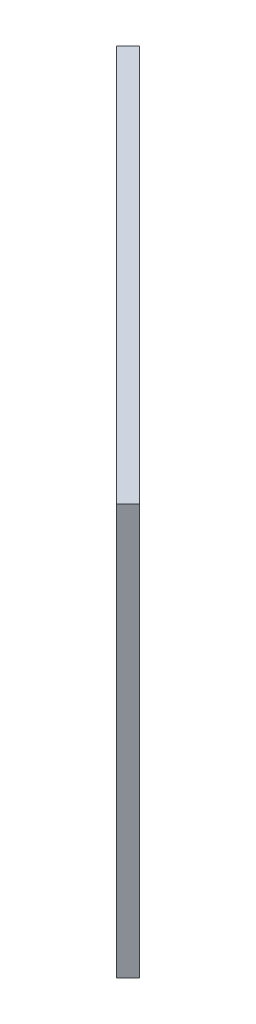
ISO-10303-21;
HEADER;
FILE_DESCRIPTION(('STEP AP214'),'2;1');
FILE_NAME('part.step','',(''),(''),'','','');
FILE_SCHEMA(('AUTOMOTIVE_DESIGN { 1 0 10303 214 1 1 1 1 }'));
ENDSEC;
DATA;
#1=APPLICATION_CONTEXT('core data for automotive mechanical design processes');
#2=APPLICATION_PROTOCOL_DEFINITION('international standard','automotive_design',2000,#1);
#3=PRODUCT_CONTEXT('',#1,'mechanical');
#4=PRODUCT('Part','Part','',(#3));
#5=PRODUCT_RELATED_PRODUCT_CATEGORY('part','',(#4));
#6=PRODUCT_DEFINITION_FORMATION('','',#4);
#7=PRODUCT_DEFINITION_CONTEXT('part definition',#1,'design');
#8=PRODUCT_DEFINITION('design','',#6,#7);
#9=PRODUCT_DEFINITION_SHAPE('','',#8);
#10=(LENGTH_UNIT() NAMED_UNIT(*) SI_UNIT(.MILLI.,.METRE.));
#11=(NAMED_UNIT(*) PLANE_ANGLE_UNIT() SI_UNIT($,.RADIAN.));
#12=(NAMED_UNIT(*) SI_UNIT($,.STERADIAN.) SOLID_ANGLE_UNIT());
#13=UNCERTAINTY_MEASURE_WITH_UNIT(LENGTH_MEASURE(1.E-05),#10,'distance_accuracy_value','');
#14=(GEOMETRIC_REPRESENTATION_CONTEXT(3) GLOBAL_UNCERTAINTY_ASSIGNED_CONTEXT((#13)) GLOBAL_UNIT_ASSIGNED_CONTEXT((#10,
#11,#12)) REPRESENTATION_CONTEXT('',''));
#15=CARTESIAN_POINT('',(0.,0.,0.));
#16=DIRECTION('',(0.,0.,1.));
#17=DIRECTION('',(1.,0.,0.));
#18=AXIS2_PLACEMENT_3D('',#15,#16,#17);
#19=CARTESIAN_POINT('',(-170.601466374617,0.,1800.11581859632));
#20=DIRECTION('',(-0.707106781186548,0.,0.707106781186547));
#21=DIRECTION('',(0.707106781186547,0.,0.707106781186548));
#22=AXIS2_PLACEMENT_3D('',#19,#20,#21);
#23=PLANE('',#22);
#24=CARTESIAN_POINT('',(-175.470561243431,0.,1795.24672372763));
#25=DIRECTION('',(0.707106781186548,0.,-0.707106781186548));
#26=DIRECTION('',(-0.707106781186548,0.,-0.707106781186548));
#27=AXIS2_PLACEMENT_3D('',#24,#25,#26);
#28=CIRCLE('',#27,9.525);
#29=CARTESIAN_POINT('',(-182.205753334233,0.,1788.51153163683));
#30=VERTEX_POINT('',#29);
#31=EDGE_CURVE('E19',#30,#30,#28,.T.);
#32=ORIENTED_EDGE('',*,*,#31,.T.);
#33=EDGE_LOOP('',(#32));
#34=FACE_BOUND('',#33,.T.);
#35=DIRECTION('',(0.,1.,0.));
#36=VECTOR('',#35,1.);
#37=CARTESIAN_POINT('',(-155.264984971073,-1.75839247554533,1815.45229999996));
#38=LINE('',#37,#36);
#39=CARTESIAN_POINT('',(-155.264984971025,15.875,1815.45229999996));
#40=VERTEX_POINT('',#39);
#41=CARTESIAN_POINT('',(-155.264984971031,-15.875,1815.45229999996));
#42=VERTEX_POINT('',#41);
#43=EDGE_CURVE('E57',#40,#42,#38,.F.);
#44=ORIENTED_EDGE('',*,*,#43,.F.);
#45=DIRECTION('',(0.707106781186837,0.,0.707106781186258));
#46=VECTOR('',#45,1.);
#47=CARTESIAN_POINT('',(-185.937947778174,15.875,1784.77933719289));
#48=LINE('',#47,#46);
#49=CARTESIAN_POINT('',(-185.937947778149,15.875,1784.77933719285));
#50=VERTEX_POINT('',#49);
#51=EDGE_CURVE('E52',#50,#40,#48,.T.);
#52=ORIENTED_EDGE('',*,*,#51,.F.);
#53=DIRECTION('',(0.,1.,0.));
#54=VECTOR('',#53,1.);
#55=CARTESIAN_POINT('',(-185.937947778199,0.751782462000776,1784.77933719286));
#56=LINE('',#55,#54);
#57=CARTESIAN_POINT('',(-185.937947778149,-15.875,1784.77933719285));
#58=VERTEX_POINT('',#57);
#59=EDGE_CURVE('E69',#58,#50,#56,.T.);
#60=ORIENTED_EDGE('',*,*,#59,.F.);
#61=DIRECTION('',(-0.707106781186544,0.,-0.707106781186551));
#62=VECTOR('',#61,1.);
#63=CARTESIAN_POINT('',(-155.26498497106,-15.875,1815.4523));
#64=LINE('',#63,#62);
#65=EDGE_CURVE('E66',#42,#58,#64,.T.);
#66=ORIENTED_EDGE('',*,*,#65,.F.);
#67=EDGE_LOOP('',(#44,#52,#60,#66));
#68=FACE_BOUND('',#67,.T.);
#69=ADVANCED_FACE('F16',(#34,#68),#23,.T.);
#70=CARTESIAN_POINT('',(-160.929626454124,-15.875,1807.9732875702));
#71=DIRECTION('',(0.,-1.,0.));
#72=DIRECTION('',(0.,0.,-1.));
#73=AXIS2_PLACEMENT_3D('',#70,#71,#72);
#74=PLANE('',#73);
#75=DIRECTION('',(0.707106781186547,0.,0.707106781186548));
#76=VECTOR('',#75,1.);
#77=CARTESIAN_POINT('',(-169.69428090126,-15.875,1799.20863312316));
#78=LINE('',#77,#76);
#79=CARTESIAN_POINT('',(-185.030762304839,-15.875,1783.87215171949));
#80=VERTEX_POINT('',#79);
#81=CARTESIAN_POINT('',(-154.357799497738,-15.875,1814.54511452661));
#82=VERTEX_POINT('',#81);
#83=EDGE_CURVE('E76',#80,#82,#78,.T.);
#84=ORIENTED_EDGE('',*,*,#83,.T.);
#85=DIRECTION('',(0.707106781186547,0.,-0.707106781186548));
#86=VECTOR('',#85,1.);
#87=CARTESIAN_POINT('',(-154.357799497703,-15.875,1814.54511452659));
#88=LINE('',#87,#86);
#89=EDGE_CURVE('E62',#42,#82,#88,.T.);
#90=ORIENTED_EDGE('',*,*,#89,.F.);
#91=ORIENTED_EDGE('',*,*,#65,.T.);
#92=DIRECTION('',(-0.707106781186547,0.,0.707106781186548));
#93=VECTOR('',#92,1.);
#94=CARTESIAN_POINT('',(-185.030762304817,-15.875,1783.87215171948));
#95=LINE('',#94,#93);
#96=EDGE_CURVE('E83',#80,#58,#95,.T.);
#97=ORIENTED_EDGE('',*,*,#96,.F.);
#98=EDGE_LOOP('',(#84,#90,#91,#97));
#99=FACE_BOUND('',#98,.T.);
#100=ADVANCED_FACE('F75',(#99),#74,.T.);
#101=CARTESIAN_POINT('',(-154.357799497703,-1.75839247554533,1814.54511452659));
#102=DIRECTION('',(0.707106781186548,0.,0.707106781186547));
#103=DIRECTION('',(0.707106781186547,0.,-0.707106781186548));
#104=AXIS2_PLACEMENT_3D('',#101,#102,#103);
#105=PLANE('',#104);
#106=DIRECTION('',(0.,1.,0.));
#107=VECTOR('',#106,1.);
#108=CARTESIAN_POINT('',(-154.357799497779,0.,1814.54511452664));
#109=LINE('',#108,#107);
#110=CARTESIAN_POINT('',(-154.357799497735,15.875,1814.54511452661));
#111=VERTEX_POINT('',#110);
#112=EDGE_CURVE('E86',#82,#111,#109,.T.);
#113=ORIENTED_EDGE('',*,*,#112,.T.);
#114=DIRECTION('',(0.707106781146968,0.,-0.707106781226127));
#115=VECTOR('',#114,1.);
#116=CARTESIAN_POINT('',(-155.264984971035,15.875,1815.4523));
#117=LINE('',#116,#115);
#118=EDGE_CURVE('E64',#40,#111,#117,.T.);
#119=ORIENTED_EDGE('',*,*,#118,.F.);
#120=ORIENTED_EDGE('',*,*,#43,.T.);
#121=ORIENTED_EDGE('',*,*,#89,.T.);
#122=EDGE_LOOP('',(#113,#119,#120,#121));
#123=FACE_BOUND('',#122,.T.);
#124=ADVANCED_FACE('F60',(#123),#105,.T.);
#125=CARTESIAN_POINT('',(-160.908091178983,15.875,1807.99482284539));
#126=DIRECTION('',(0.,1.,0.));
#127=DIRECTION('',(0.,0.,1.));
#128=AXIS2_PLACEMENT_3D('',#125,#126,#127);
#129=PLANE('',#128);
#130=DIRECTION('',(0.707106781186547,0.,0.707106781186548));
#131=VECTOR('',#130,1.);
#132=CARTESIAN_POINT('',(-169.69428090126,15.875,1799.20863312316));
#133=LINE('',#132,#131);
#134=CARTESIAN_POINT('',(-185.030762304852,15.875,1783.87215171949));
#135=VERTEX_POINT('',#134);
#136=EDGE_CURVE('E88',#111,#135,#133,.F.);
#137=ORIENTED_EDGE('',*,*,#136,.T.);
#138=DIRECTION('',(-0.707106781186547,0.,0.707106781186548));
#139=VECTOR('',#138,1.);
#140=CARTESIAN_POINT('',(-185.030762304817,15.875,1783.87215171948));
#141=LINE('',#140,#139);
#142=EDGE_CURVE('E33',#50,#135,#141,.F.);
#143=ORIENTED_EDGE('',*,*,#142,.F.);
#144=ORIENTED_EDGE('',*,*,#51,.T.);
#145=ORIENTED_EDGE('',*,*,#118,.T.);
#146=EDGE_LOOP('',(#137,#143,#144,#145));
#147=FACE_BOUND('',#146,.T.);
#148=ADVANCED_FACE('F95',(#147),#129,.T.);
#149=CARTESIAN_POINT('',(-185.030762304817,0.751782462000776,1783.87215171948));
#150=DIRECTION('',(-0.707106781186548,0.,-0.707106781186547));
#151=DIRECTION('',(-0.707106781186547,0.,0.707106781186548));
#152=AXIS2_PLACEMENT_3D('',#149,#150,#151);
#153=PLANE('',#152);
#154=DIRECTION('',(0.,1.,0.));
#155=VECTOR('',#154,1.);
#156=CARTESIAN_POINT('',(-185.030762304893,0.,1783.87215171953));
#157=LINE('',#156,#155);
#158=EDGE_CURVE('E25',#135,#80,#157,.F.);
#159=ORIENTED_EDGE('',*,*,#158,.T.);
#160=ORIENTED_EDGE('',*,*,#96,.T.);
#161=ORIENTED_EDGE('',*,*,#59,.T.);
#162=ORIENTED_EDGE('',*,*,#142,.T.);
#163=EDGE_LOOP('',(#159,#160,#161,#162));
#164=FACE_BOUND('',#163,.T.);
#165=ADVANCED_FACE('F91',(#164),#153,.T.);
#166=CARTESIAN_POINT('',(-174.563375770112,0.,1794.33953825431));
#167=DIRECTION('',(0.707106781186548,0.,-0.707106781186548));
#168=DIRECTION('',(-0.707106781186548,0.,-0.707106781186548));
#169=AXIS2_PLACEMENT_3D('',#166,#167,#168);
#170=CYLINDRICAL_SURFACE('',#169,9.525);
#171=CARTESIAN_POINT('',(-174.563375770175,0.,1794.33953825437));
#172=DIRECTION('',(0.707106781186548,0.,-0.707106781186548));
#173=DIRECTION('',(-0.707106781186548,0.,-0.707106781186548));
#174=AXIS2_PLACEMENT_3D('',#171,#172,#173);
#175=CIRCLE('',#174,9.525);
#176=CARTESIAN_POINT('',(-181.298567860977,0.,1787.60434616357));
#177=VERTEX_POINT('',#176);
#178=EDGE_CURVE('E11',#177,#177,#175,.T.);
#179=ORIENTED_EDGE('',*,*,#178,.T.);
#180=EDGE_LOOP('',(#179));
#181=FACE_BOUND('',#180,.T.);
#182=ORIENTED_EDGE('',*,*,#31,.F.);
#183=EDGE_LOOP('',(#182));
#184=FACE_BOUND('',#183,.T.);
#185=ADVANCED_FACE('F103',(#181,#184),#170,.F.);
#186=CARTESIAN_POINT('',(-169.69428090126,0.,1799.20863312316));
#187=DIRECTION('',(-0.707106781186548,0.,0.707106781186547));
#188=DIRECTION('',(0.707106781186547,0.,0.707106781186548));
#189=AXIS2_PLACEMENT_3D('',#186,#187,#188);
#190=PLANE('',#189);
#191=ORIENTED_EDGE('',*,*,#178,.F.);
#192=EDGE_LOOP('',(#191));
#193=FACE_BOUND('',#192,.T.);
#194=ORIENTED_EDGE('',*,*,#136,.F.);
#195=ORIENTED_EDGE('',*,*,#112,.F.);
#196=ORIENTED_EDGE('',*,*,#83,.F.);
#197=ORIENTED_EDGE('',*,*,#158,.F.);
#198=EDGE_LOOP('',(#194,#195,#196,#197));
#199=FACE_BOUND('',#198,.T.);
#200=ADVANCED_FACE('F94',(#193,#199),#190,.F.);
#201=CLOSED_SHELL('',(#69,#100,#124,#148,#165,#185,#200));
#202=MANIFOLD_SOLID_BREP('B1',#201);
#203=ADVANCED_BREP_SHAPE_REPRESENTATION('',(#18,#202),#14);
#204=SHAPE_DEFINITION_REPRESENTATION(#9,#203);
ENDSEC;
END-ISO-10303-21;
